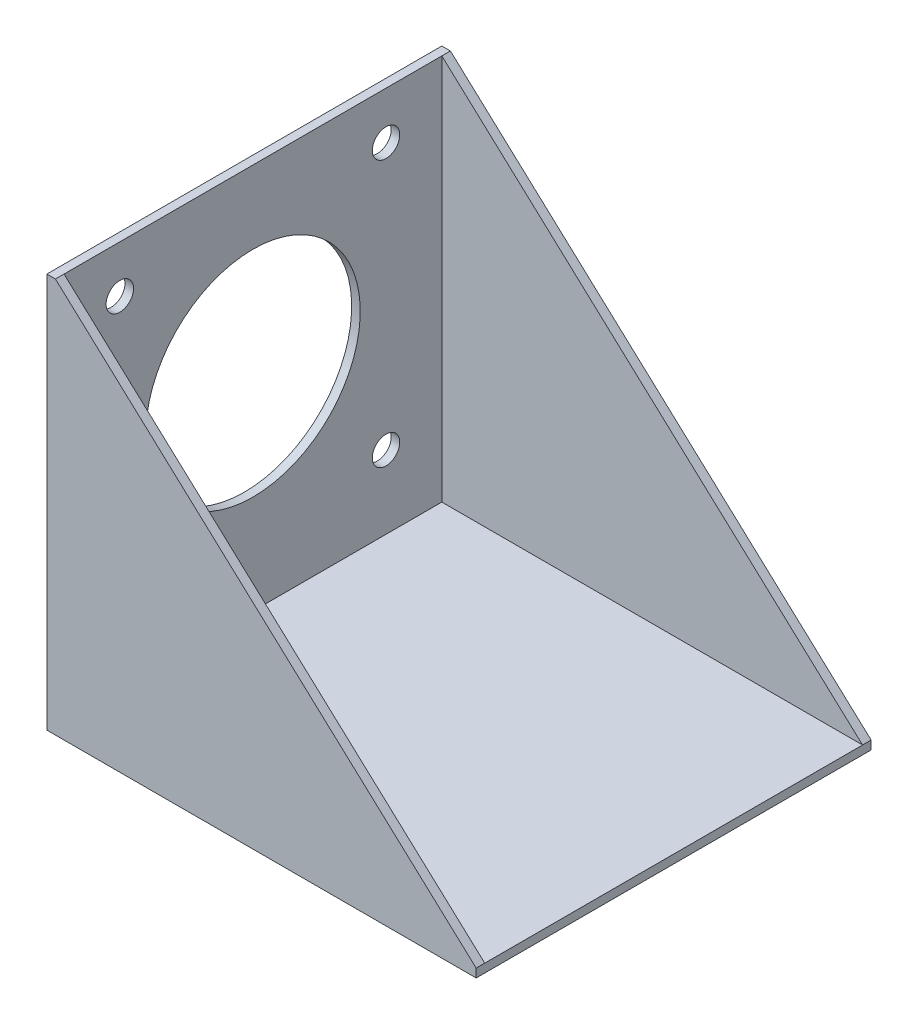
ISO-10303-21;
HEADER;
FILE_DESCRIPTION(('STEP AP214'),'2;1');
FILE_NAME('part.step','',(''),(''),'','','');
FILE_SCHEMA(('AUTOMOTIVE_DESIGN { 1 0 10303 214 1 1 1 1 }'));
ENDSEC;
DATA;
#1=APPLICATION_CONTEXT('core data for automotive mechanical design processes');
#2=APPLICATION_PROTOCOL_DEFINITION('international standard','automotive_design',2000,#1);
#3=PRODUCT_CONTEXT('',#1,'mechanical');
#4=PRODUCT('Part','Part','',(#3));
#5=PRODUCT_RELATED_PRODUCT_CATEGORY('part','',(#4));
#6=PRODUCT_DEFINITION_FORMATION('','',#4);
#7=PRODUCT_DEFINITION_CONTEXT('part definition',#1,'design');
#8=PRODUCT_DEFINITION('design','',#6,#7);
#9=PRODUCT_DEFINITION_SHAPE('','',#8);
#10=(LENGTH_UNIT() NAMED_UNIT(*) SI_UNIT(.MILLI.,.METRE.));
#11=(NAMED_UNIT(*) PLANE_ANGLE_UNIT() SI_UNIT($,.RADIAN.));
#12=(NAMED_UNIT(*) SI_UNIT($,.STERADIAN.) SOLID_ANGLE_UNIT());
#13=UNCERTAINTY_MEASURE_WITH_UNIT(LENGTH_MEASURE(1.E-05),#10,'distance_accuracy_value','');
#14=(GEOMETRIC_REPRESENTATION_CONTEXT(3) GLOBAL_UNCERTAINTY_ASSIGNED_CONTEXT((#13)) GLOBAL_UNIT_ASSIGNED_CONTEXT((#10,
#11,#12)) REPRESENTATION_CONTEXT('',''));
#15=CARTESIAN_POINT('',(0.,0.,0.));
#16=DIRECTION('',(0.,0.,1.));
#17=DIRECTION('',(1.,0.,0.));
#18=AXIS2_PLACEMENT_3D('',#15,#16,#17);
#19=CARTESIAN_POINT('',(1.,1.,46.));
#20=DIRECTION('',(0.,-1.,0.));
#21=DIRECTION('',(0.,0.,-1.));
#22=AXIS2_PLACEMENT_3D('',#19,#20,#21);
#23=PLANE('',#22);
#24=DIRECTION('',(0.,0.,-1.));
#25=VECTOR('',#24,1.);
#26=CARTESIAN_POINT('',(50.,1.,46.));
#27=LINE('',#26,#25);
#28=CARTESIAN_POINT('',(50.,1.,45.));
#29=VERTEX_POINT('',#28);
#30=CARTESIAN_POINT('',(50.,1.,1.));
#31=VERTEX_POINT('',#30);
#32=EDGE_CURVE('E118',#29,#31,#27,.T.);
#33=ORIENTED_EDGE('',*,*,#32,.T.);
#34=DIRECTION('',(-1.,0.,0.));
#35=VECTOR('',#34,1.);
#36=CARTESIAN_POINT('',(50.,1.,1.));
#37=LINE('',#36,#35);
#38=CARTESIAN_POINT('',(1.,1.,1.));
#39=VERTEX_POINT('',#38);
#40=EDGE_CURVE('E51',#31,#39,#37,.T.);
#41=ORIENTED_EDGE('',*,*,#40,.T.);
#42=DIRECTION('',(0.,0.,-1.));
#43=VECTOR('',#42,1.);
#44=CARTESIAN_POINT('',(1.,1.,46.));
#45=LINE('',#44,#43);
#46=CARTESIAN_POINT('',(1.,1.,45.));
#47=VERTEX_POINT('',#46);
#48=EDGE_CURVE('E113',#47,#39,#45,.T.);
#49=ORIENTED_EDGE('',*,*,#48,.F.);
#50=DIRECTION('',(1.,0.,0.));
#51=VECTOR('',#50,1.);
#52=CARTESIAN_POINT('',(50.,1.,45.));
#53=LINE('',#52,#51);
#54=EDGE_CURVE('E104',#47,#29,#53,.T.);
#55=ORIENTED_EDGE('',*,*,#54,.T.);
#56=EDGE_LOOP('',(#33,#41,#49,#55));
#57=FACE_BOUND('',#56,.T.);
#58=ADVANCED_FACE('F36',(#57),#23,.F.);
#59=CARTESIAN_POINT('',(0.999999999999998,46.,46.));
#60=DIRECTION('',(-1.,0.,0.));
#61=DIRECTION('',(0.,-1.,0.));
#62=AXIS2_PLACEMENT_3D('',#59,#60,#61);
#63=PLANE('',#62);
#64=CARTESIAN_POINT('',(0.999999999999999,40.5,38.5));
#65=DIRECTION('',(-1.,0.,0.));
#66=DIRECTION('',(0.,1.,0.));
#67=AXIS2_PLACEMENT_3D('',#64,#65,#66);
#68=CIRCLE('',#67,1.6);
#69=CARTESIAN_POINT('',(0.999999999999999,42.1,38.5));
#70=VERTEX_POINT('',#69);
#71=EDGE_CURVE('E179',#70,#70,#68,.T.);
#72=ORIENTED_EDGE('',*,*,#71,.T.);
#73=EDGE_LOOP('',(#72));
#74=FACE_BOUND('',#73,.T.);
#75=CARTESIAN_POINT('',(1.,9.5,7.5));
#76=DIRECTION('',(-1.,0.,0.));
#77=DIRECTION('',(0.,-1.,0.));
#78=AXIS2_PLACEMENT_3D('',#75,#76,#77);
#79=CIRCLE('',#78,1.6);
#80=CARTESIAN_POINT('',(1.,7.9,7.5));
#81=VERTEX_POINT('',#80);
#82=EDGE_CURVE('E185',#81,#81,#79,.T.);
#83=ORIENTED_EDGE('',*,*,#82,.T.);
#84=EDGE_LOOP('',(#83));
#85=FACE_BOUND('',#84,.T.);
#86=CARTESIAN_POINT('',(1.,9.5,38.5));
#87=DIRECTION('',(-1.,0.,0.));
#88=DIRECTION('',(0.,1.,0.));
#89=AXIS2_PLACEMENT_3D('',#86,#87,#88);
#90=CIRCLE('',#89,1.6);
#91=CARTESIAN_POINT('',(1.,11.1,38.5));
#92=VERTEX_POINT('',#91);
#93=EDGE_CURVE('E186',#92,#92,#90,.T.);
#94=ORIENTED_EDGE('',*,*,#93,.T.);
#95=EDGE_LOOP('',(#94));
#96=FACE_BOUND('',#95,.T.);
#97=CARTESIAN_POINT('',(0.999999999999999,25.,23.));
#98=DIRECTION('',(-1.,0.,0.));
#99=DIRECTION('',(0.,-1.,0.));
#100=AXIS2_PLACEMENT_3D('',#97,#98,#99);
#101=CIRCLE('',#100,12.5);
#102=CARTESIAN_POINT('',(1.,12.5,23.));
#103=VERTEX_POINT('',#102);
#104=EDGE_CURVE('E197',#103,#103,#101,.T.);
#105=ORIENTED_EDGE('',*,*,#104,.T.);
#106=EDGE_LOOP('',(#105));
#107=FACE_BOUND('',#106,.T.);
#108=CARTESIAN_POINT('',(0.999999999999999,40.5,7.5));
#109=DIRECTION('',(-1.,0.,0.));
#110=DIRECTION('',(0.,-1.,0.));
#111=AXIS2_PLACEMENT_3D('',#108,#109,#110);
#112=CIRCLE('',#111,1.6);
#113=CARTESIAN_POINT('',(0.999999999999999,38.9,7.5));
#114=VERTEX_POINT('',#113);
#115=EDGE_CURVE('E170',#114,#114,#112,.T.);
#116=ORIENTED_EDGE('',*,*,#115,.T.);
#117=EDGE_LOOP('',(#116));
#118=FACE_BOUND('',#117,.T.);
#119=ORIENTED_EDGE('',*,*,#48,.T.);
#120=DIRECTION('',(0.,1.,0.));
#121=VECTOR('',#120,1.);
#122=CARTESIAN_POINT('',(1.,1.,1.));
#123=LINE('',#122,#121);
#124=CARTESIAN_POINT('',(0.999999999999998,46.,1.));
#125=VERTEX_POINT('',#124);
#126=EDGE_CURVE('E58',#39,#125,#123,.T.);
#127=ORIENTED_EDGE('',*,*,#126,.T.);
#128=DIRECTION('',(0.,0.,-1.));
#129=VECTOR('',#128,1.);
#130=CARTESIAN_POINT('',(0.999999999999998,46.,46.));
#131=LINE('',#130,#129);
#132=CARTESIAN_POINT('',(0.999999999999998,46.,45.));
#133=VERTEX_POINT('',#132);
#134=EDGE_CURVE('E114',#133,#125,#131,.T.);
#135=ORIENTED_EDGE('',*,*,#134,.F.);
#136=DIRECTION('',(0.,-1.,0.));
#137=VECTOR('',#136,1.);
#138=CARTESIAN_POINT('',(1.,1.,45.));
#139=LINE('',#138,#137);
#140=EDGE_CURVE('E107',#133,#47,#139,.T.);
#141=ORIENTED_EDGE('',*,*,#140,.T.);
#142=EDGE_LOOP('',(#119,#127,#135,#141));
#143=FACE_BOUND('',#142,.T.);
#144=ADVANCED_FACE('F112',(#74,#85,#96,#107,#118,#143),#63,.F.);
#145=CARTESIAN_POINT('',(0.999999999999998,46.,46.));
#146=DIRECTION('',(0.,-1.,0.));
#147=DIRECTION('',(0.,0.,-1.));
#148=AXIS2_PLACEMENT_3D('',#145,#146,#147);
#149=PLANE('',#148);
#150=DIRECTION('',(-1.,0.,0.));
#151=VECTOR('',#150,1.);
#152=CARTESIAN_POINT('',(0.999999999999998,46.,0.));
#153=LINE('',#152,#151);
#154=CARTESIAN_POINT('',(0.999999999999998,46.,0.));
#155=VERTEX_POINT('',#154);
#156=CARTESIAN_POINT('',(0.,46.,0.));
#157=VERTEX_POINT('',#156);
#158=EDGE_CURVE('E147',#155,#157,#153,.T.);
#159=ORIENTED_EDGE('',*,*,#158,.T.);
#160=DIRECTION('',(0.,0.,-1.));
#161=VECTOR('',#160,1.);
#162=CARTESIAN_POINT('',(0.,46.,46.));
#163=LINE('',#162,#161);
#164=CARTESIAN_POINT('',(0.,46.,46.));
#165=VERTEX_POINT('',#164);
#166=EDGE_CURVE('E11',#165,#157,#163,.T.);
#167=ORIENTED_EDGE('',*,*,#166,.F.);
#168=DIRECTION('',(-1.,0.,0.));
#169=VECTOR('',#168,1.);
#170=CARTESIAN_POINT('',(0.999999999999998,46.,46.));
#171=LINE('',#170,#169);
#172=CARTESIAN_POINT('',(0.999999999999998,46.,46.));
#173=VERTEX_POINT('',#172);
#174=EDGE_CURVE('E146',#173,#165,#171,.T.);
#175=ORIENTED_EDGE('',*,*,#174,.F.);
#176=EDGE_CURVE('E119',#173,#133,#131,.T.);
#177=ORIENTED_EDGE('',*,*,#176,.T.);
#178=ORIENTED_EDGE('',*,*,#134,.T.);
#179=DIRECTION('',(0.,0.,-1.));
#180=VECTOR('',#179,1.);
#181=CARTESIAN_POINT('',(0.999999999999998,46.,1.));
#182=LINE('',#181,#180);
#183=EDGE_CURVE('E164',#125,#155,#182,.T.);
#184=ORIENTED_EDGE('',*,*,#183,.T.);
#185=EDGE_LOOP('',(#159,#167,#175,#177,#178,#184));
#186=FACE_BOUND('',#185,.T.);
#187=ADVANCED_FACE('F38',(#186),#149,.F.);
#188=CARTESIAN_POINT('',(0.,46.,46.));
#189=DIRECTION('',(1.,0.,0.));
#190=DIRECTION('',(0.,1.,0.));
#191=AXIS2_PLACEMENT_3D('',#188,#189,#190);
#192=PLANE('',#191);
#193=CARTESIAN_POINT('',(0.,40.5,38.5));
#194=DIRECTION('',(-1.,0.,0.));
#195=DIRECTION('',(0.,1.,0.));
#196=AXIS2_PLACEMENT_3D('',#193,#194,#195);
#197=CIRCLE('',#196,1.6);
#198=CARTESIAN_POINT('',(0.,42.1,38.5));
#199=VERTEX_POINT('',#198);
#200=EDGE_CURVE('E189',#199,#199,#197,.T.);
#201=ORIENTED_EDGE('',*,*,#200,.F.);
#202=EDGE_LOOP('',(#201));
#203=FACE_BOUND('',#202,.T.);
#204=CARTESIAN_POINT('',(0.,9.5,7.5));
#205=DIRECTION('',(-1.,0.,0.));
#206=DIRECTION('',(0.,-1.,0.));
#207=AXIS2_PLACEMENT_3D('',#204,#205,#206);
#208=CIRCLE('',#207,1.6);
#209=CARTESIAN_POINT('',(0.,7.9,7.5));
#210=VERTEX_POINT('',#209);
#211=EDGE_CURVE('E182',#210,#210,#208,.T.);
#212=ORIENTED_EDGE('',*,*,#211,.F.);
#213=EDGE_LOOP('',(#212));
#214=FACE_BOUND('',#213,.T.);
#215=CARTESIAN_POINT('',(0.,9.5,38.5));
#216=DIRECTION('',(-1.,0.,0.));
#217=DIRECTION('',(0.,1.,0.));
#218=AXIS2_PLACEMENT_3D('',#215,#216,#217);
#219=CIRCLE('',#218,1.6);
#220=CARTESIAN_POINT('',(0.,11.1,38.5));
#221=VERTEX_POINT('',#220);
#222=EDGE_CURVE('E200',#221,#221,#219,.T.);
#223=ORIENTED_EDGE('',*,*,#222,.F.);
#224=EDGE_LOOP('',(#223));
#225=FACE_BOUND('',#224,.T.);
#226=CARTESIAN_POINT('',(0.,25.,23.));
#227=DIRECTION('',(-1.,0.,0.));
#228=DIRECTION('',(0.,-1.,0.));
#229=AXIS2_PLACEMENT_3D('',#226,#227,#228);
#230=CIRCLE('',#229,12.5);
#231=CARTESIAN_POINT('',(0.,12.5,23.));
#232=VERTEX_POINT('',#231);
#233=EDGE_CURVE('E194',#232,#232,#230,.T.);
#234=ORIENTED_EDGE('',*,*,#233,.F.);
#235=EDGE_LOOP('',(#234));
#236=FACE_BOUND('',#235,.T.);
#237=CARTESIAN_POINT('',(0.,40.5,7.5));
#238=DIRECTION('',(-1.,0.,0.));
#239=DIRECTION('',(0.,-1.,0.));
#240=AXIS2_PLACEMENT_3D('',#237,#238,#239);
#241=CIRCLE('',#240,1.6);
#242=CARTESIAN_POINT('',(0.,38.9,7.5));
#243=VERTEX_POINT('',#242);
#244=EDGE_CURVE('E176',#243,#243,#241,.T.);
#245=ORIENTED_EDGE('',*,*,#244,.F.);
#246=EDGE_LOOP('',(#245));
#247=FACE_BOUND('',#246,.T.);
#248=DIRECTION('',(0.,-1.,0.));
#249=VECTOR('',#248,1.);
#250=CARTESIAN_POINT('',(0.,46.,0.));
#251=LINE('',#250,#249);
#252=CARTESIAN_POINT('',(0.,0.,0.));
#253=VERTEX_POINT('',#252);
#254=EDGE_CURVE('E142',#157,#253,#251,.T.);
#255=ORIENTED_EDGE('',*,*,#254,.T.);
#256=DIRECTION('',(0.,0.,-1.));
#257=VECTOR('',#256,1.);
#258=CARTESIAN_POINT('',(0.,0.,46.));
#259=LINE('',#258,#257);
#260=CARTESIAN_POINT('',(0.,0.,46.));
#261=VERTEX_POINT('',#260);
#262=EDGE_CURVE('E44',#261,#253,#259,.T.);
#263=ORIENTED_EDGE('',*,*,#262,.F.);
#264=DIRECTION('',(0.,-1.,0.));
#265=VECTOR('',#264,1.);
#266=CARTESIAN_POINT('',(0.,46.,46.));
#267=LINE('',#266,#265);
#268=EDGE_CURVE('E156',#165,#261,#267,.T.);
#269=ORIENTED_EDGE('',*,*,#268,.F.);
#270=ORIENTED_EDGE('',*,*,#166,.T.);
#271=EDGE_LOOP('',(#255,#263,#269,#270));
#272=FACE_BOUND('',#271,.T.);
#273=ADVANCED_FACE('F216',(#203,#214,#225,#236,#247,#272),#192,.F.);
#274=CARTESIAN_POINT('',(0.,0.,46.));
#275=DIRECTION('',(0.,1.,0.));
#276=DIRECTION('',(0.,0.,1.));
#277=AXIS2_PLACEMENT_3D('',#274,#275,#276);
#278=PLANE('',#277);
#279=DIRECTION('',(1.,0.,0.));
#280=VECTOR('',#279,1.);
#281=CARTESIAN_POINT('',(0.,0.,0.));
#282=LINE('',#281,#280);
#283=CARTESIAN_POINT('',(50.,0.,0.));
#284=VERTEX_POINT('',#283);
#285=EDGE_CURVE('E135',#253,#284,#282,.T.);
#286=ORIENTED_EDGE('',*,*,#285,.T.);
#287=DIRECTION('',(0.,0.,-1.));
#288=VECTOR('',#287,1.);
#289=CARTESIAN_POINT('',(50.,0.,46.));
#290=LINE('',#289,#288);
#291=CARTESIAN_POINT('',(50.,0.,46.));
#292=VERTEX_POINT('',#291);
#293=EDGE_CURVE('E126',#292,#284,#290,.T.);
#294=ORIENTED_EDGE('',*,*,#293,.F.);
#295=DIRECTION('',(1.,0.,0.));
#296=VECTOR('',#295,1.);
#297=CARTESIAN_POINT('',(0.,0.,46.));
#298=LINE('',#297,#296);
#299=EDGE_CURVE('E136',#261,#292,#298,.T.);
#300=ORIENTED_EDGE('',*,*,#299,.F.);
#301=ORIENTED_EDGE('',*,*,#262,.T.);
#302=EDGE_LOOP('',(#286,#294,#300,#301));
#303=FACE_BOUND('',#302,.T.);
#304=ADVANCED_FACE('F133',(#303),#278,.F.);
#305=CARTESIAN_POINT('',(50.,0.,46.));
#306=DIRECTION('',(-1.,0.,0.));
#307=DIRECTION('',(0.,0.,1.));
#308=AXIS2_PLACEMENT_3D('',#305,#306,#307);
#309=PLANE('',#308);
#310=DIRECTION('',(0.,1.,0.));
#311=VECTOR('',#310,1.);
#312=CARTESIAN_POINT('',(50.,0.,0.));
#313=LINE('',#312,#311);
#314=CARTESIAN_POINT('',(50.,1.,0.));
#315=VERTEX_POINT('',#314);
#316=EDGE_CURVE('E144',#284,#315,#313,.T.);
#317=ORIENTED_EDGE('',*,*,#316,.T.);
#318=DIRECTION('',(0.,0.,-1.));
#319=VECTOR('',#318,1.);
#320=CARTESIAN_POINT('',(50.,1.,1.));
#321=LINE('',#320,#319);
#322=EDGE_CURVE('E162',#31,#315,#321,.T.);
#323=ORIENTED_EDGE('',*,*,#322,.F.);
#324=ORIENTED_EDGE('',*,*,#32,.F.);
#325=CARTESIAN_POINT('',(50.,1.,46.));
#326=VERTEX_POINT('',#325);
#327=EDGE_CURVE('E121',#326,#29,#27,.T.);
#328=ORIENTED_EDGE('',*,*,#327,.F.);
#329=DIRECTION('',(0.,1.,0.));
#330=VECTOR('',#329,1.);
#331=CARTESIAN_POINT('',(50.,0.,46.));
#332=LINE('',#331,#330);
#333=EDGE_CURVE('E152',#292,#326,#332,.T.);
#334=ORIENTED_EDGE('',*,*,#333,.F.);
#335=ORIENTED_EDGE('',*,*,#293,.T.);
#336=EDGE_LOOP('',(#317,#323,#324,#328,#334,#335));
#337=FACE_BOUND('',#336,.T.);
#338=ADVANCED_FACE('F232',(#337),#309,.F.);
#339=CARTESIAN_POINT('',(0.,0.,46.));
#340=DIRECTION('',(0.,0.,1.));
#341=DIRECTION('',(1.,0.,0.));
#342=AXIS2_PLACEMENT_3D('',#339,#340,#341);
#343=PLANE('',#342);
#344=DIRECTION('',(-0.736529888427939,0.676404999576679,0.));
#345=VECTOR('',#344,1.);
#346=CARTESIAN_POINT('',(0.999999999999998,46.,46.));
#347=LINE('',#346,#345);
#348=EDGE_CURVE('E116',#326,#173,#347,.T.);
#349=ORIENTED_EDGE('',*,*,#348,.T.);
#350=ORIENTED_EDGE('',*,*,#174,.T.);
#351=ORIENTED_EDGE('',*,*,#268,.T.);
#352=ORIENTED_EDGE('',*,*,#299,.T.);
#353=ORIENTED_EDGE('',*,*,#333,.T.);
#354=EDGE_LOOP('',(#349,#350,#351,#352,#353));
#355=FACE_BOUND('',#354,.T.);
#356=ADVANCED_FACE('F236',(#355),#343,.T.);
#357=CARTESIAN_POINT('',(0.,0.,0.));
#358=DIRECTION('',(0.,0.,1.));
#359=DIRECTION('',(1.,0.,0.));
#360=AXIS2_PLACEMENT_3D('',#357,#358,#359);
#361=PLANE('',#360);
#362=ORIENTED_EDGE('',*,*,#158,.F.);
#363=DIRECTION('',(0.736529888427939,-0.676404999576679,0.));
#364=VECTOR('',#363,1.);
#365=CARTESIAN_POINT('',(0.999999999999998,46.,0.));
#366=LINE('',#365,#364);
#367=EDGE_CURVE('E168',#155,#315,#366,.T.);
#368=ORIENTED_EDGE('',*,*,#367,.T.);
#369=ORIENTED_EDGE('',*,*,#316,.F.);
#370=ORIENTED_EDGE('',*,*,#285,.F.);
#371=ORIENTED_EDGE('',*,*,#254,.F.);
#372=EDGE_LOOP('',(#362,#368,#369,#370,#371));
#373=FACE_BOUND('',#372,.T.);
#374=ADVANCED_FACE('F141',(#373),#361,.F.);
#375=CARTESIAN_POINT('',(0.999999999999998,46.,45.));
#376=DIRECTION('',(0.676404999576679,0.73652988842794,0.));
#377=DIRECTION('',(-0.736529888427939,0.676404999576679,0.));
#378=AXIS2_PLACEMENT_3D('',#375,#376,#377);
#379=PLANE('',#378);
#380=ORIENTED_EDGE('',*,*,#348,.F.);
#381=ORIENTED_EDGE('',*,*,#327,.T.);
#382=DIRECTION('',(-0.736529888427939,0.676404999576679,0.));
#383=VECTOR('',#382,1.);
#384=CARTESIAN_POINT('',(0.999999999999998,46.,45.));
#385=LINE('',#384,#383);
#386=EDGE_CURVE('E109',#29,#133,#385,.T.);
#387=ORIENTED_EDGE('',*,*,#386,.T.);
#388=ORIENTED_EDGE('',*,*,#176,.F.);
#389=EDGE_LOOP('',(#380,#381,#387,#388));
#390=FACE_BOUND('',#389,.T.);
#391=ADVANCED_FACE('F238',(#390),#379,.T.);
#392=CARTESIAN_POINT('',(0.,0.,45.));
#393=DIRECTION('',(0.,0.,1.));
#394=DIRECTION('',(1.,0.,0.));
#395=AXIS2_PLACEMENT_3D('',#392,#393,#394);
#396=PLANE('',#395);
#397=ORIENTED_EDGE('',*,*,#140,.F.);
#398=ORIENTED_EDGE('',*,*,#386,.F.);
#399=ORIENTED_EDGE('',*,*,#54,.F.);
#400=EDGE_LOOP('',(#397,#398,#399));
#401=FACE_BOUND('',#400,.T.);
#402=ADVANCED_FACE('F106',(#401),#396,.F.);
#403=CARTESIAN_POINT('',(0.999999999999998,46.,1.));
#404=DIRECTION('',(0.676404999576679,0.73652988842794,0.));
#405=DIRECTION('',(-0.736529888427939,0.676404999576679,0.));
#406=AXIS2_PLACEMENT_3D('',#403,#404,#405);
#407=PLANE('',#406);
#408=ORIENTED_EDGE('',*,*,#367,.F.);
#409=ORIENTED_EDGE('',*,*,#183,.F.);
#410=DIRECTION('',(0.736529888427939,-0.676404999576679,0.));
#411=VECTOR('',#410,1.);
#412=CARTESIAN_POINT('',(0.999999999999998,46.,1.));
#413=LINE('',#412,#411);
#414=EDGE_CURVE('E172',#125,#31,#413,.T.);
#415=ORIENTED_EDGE('',*,*,#414,.T.);
#416=ORIENTED_EDGE('',*,*,#322,.T.);
#417=EDGE_LOOP('',(#408,#409,#415,#416));
#418=FACE_BOUND('',#417,.T.);
#419=ADVANCED_FACE('F229',(#418),#407,.T.);
#420=CARTESIAN_POINT('',(0.,0.,1.));
#421=DIRECTION('',(0.,0.,1.));
#422=DIRECTION('',(1.,0.,0.));
#423=AXIS2_PLACEMENT_3D('',#420,#421,#422);
#424=PLANE('',#423);
#425=ORIENTED_EDGE('',*,*,#126,.F.);
#426=ORIENTED_EDGE('',*,*,#40,.F.);
#427=ORIENTED_EDGE('',*,*,#414,.F.);
#428=EDGE_LOOP('',(#425,#426,#427));
#429=FACE_BOUND('',#428,.T.);
#430=ADVANCED_FACE('F291',(#429),#424,.T.);
#431=CARTESIAN_POINT('',(0.999999999999999,40.5,7.5));
#432=DIRECTION('',(-1.,0.,0.));
#433=DIRECTION('',(0.,-1.,0.));
#434=AXIS2_PLACEMENT_3D('',#431,#432,#433);
#435=CYLINDRICAL_SURFACE('',#434,1.6);
#436=ORIENTED_EDGE('',*,*,#115,.F.);
#437=EDGE_LOOP('',(#436));
#438=FACE_BOUND('',#437,.T.);
#439=ORIENTED_EDGE('',*,*,#244,.T.);
#440=EDGE_LOOP('',(#439));
#441=FACE_BOUND('',#440,.T.);
#442=ADVANCED_FACE('F299',(#438,#441),#435,.F.);
#443=CARTESIAN_POINT('',(0.999999999999999,25.,23.));
#444=DIRECTION('',(-1.,0.,0.));
#445=DIRECTION('',(0.,-1.,0.));
#446=AXIS2_PLACEMENT_3D('',#443,#444,#445);
#447=CYLINDRICAL_SURFACE('',#446,12.5);
#448=ORIENTED_EDGE('',*,*,#104,.F.);
#449=EDGE_LOOP('',(#448));
#450=FACE_BOUND('',#449,.T.);
#451=ORIENTED_EDGE('',*,*,#233,.T.);
#452=EDGE_LOOP('',(#451));
#453=FACE_BOUND('',#452,.T.);
#454=ADVANCED_FACE('F212',(#450,#453),#447,.F.);
#455=CARTESIAN_POINT('',(1.,9.5,38.5));
#456=DIRECTION('',(-1.,0.,0.));
#457=DIRECTION('',(0.,-1.,0.));
#458=AXIS2_PLACEMENT_3D('',#455,#456,#457);
#459=CYLINDRICAL_SURFACE('',#458,1.6);
#460=ORIENTED_EDGE('',*,*,#93,.F.);
#461=EDGE_LOOP('',(#460));
#462=FACE_BOUND('',#461,.T.);
#463=ORIENTED_EDGE('',*,*,#222,.T.);
#464=EDGE_LOOP('',(#463));
#465=FACE_BOUND('',#464,.T.);
#466=ADVANCED_FACE('F208',(#462,#465),#459,.F.);
#467=CARTESIAN_POINT('',(1.,9.5,7.5));
#468=DIRECTION('',(-1.,0.,0.));
#469=DIRECTION('',(0.,-1.,0.));
#470=AXIS2_PLACEMENT_3D('',#467,#468,#469);
#471=CYLINDRICAL_SURFACE('',#470,1.6);
#472=ORIENTED_EDGE('',*,*,#82,.F.);
#473=EDGE_LOOP('',(#472));
#474=FACE_BOUND('',#473,.T.);
#475=ORIENTED_EDGE('',*,*,#211,.T.);
#476=EDGE_LOOP('',(#475));
#477=FACE_BOUND('',#476,.T.);
#478=ADVANCED_FACE('F211',(#474,#477),#471,.F.);
#479=CARTESIAN_POINT('',(0.999999999999999,40.5,38.5));
#480=DIRECTION('',(-1.,0.,0.));
#481=DIRECTION('',(0.,-1.,0.));
#482=AXIS2_PLACEMENT_3D('',#479,#480,#481);
#483=CYLINDRICAL_SURFACE('',#482,1.6);
#484=ORIENTED_EDGE('',*,*,#71,.F.);
#485=EDGE_LOOP('',(#484));
#486=FACE_BOUND('',#485,.T.);
#487=ORIENTED_EDGE('',*,*,#200,.T.);
#488=EDGE_LOOP('',(#487));
#489=FACE_BOUND('',#488,.T.);
#490=ADVANCED_FACE('F338',(#486,#489),#483,.F.);
#491=CLOSED_SHELL('',(#58,#144,#187,#273,#304,#338,#356,#374,#391,#402,#419,#430,#442,#454,#466,
#478,#490));
#492=MANIFOLD_SOLID_BREP('B2',#491);
#493=ADVANCED_BREP_SHAPE_REPRESENTATION('',(#18,#492),#14);
#494=SHAPE_DEFINITION_REPRESENTATION(#9,#493);
ENDSEC;
END-ISO-10303-21;
